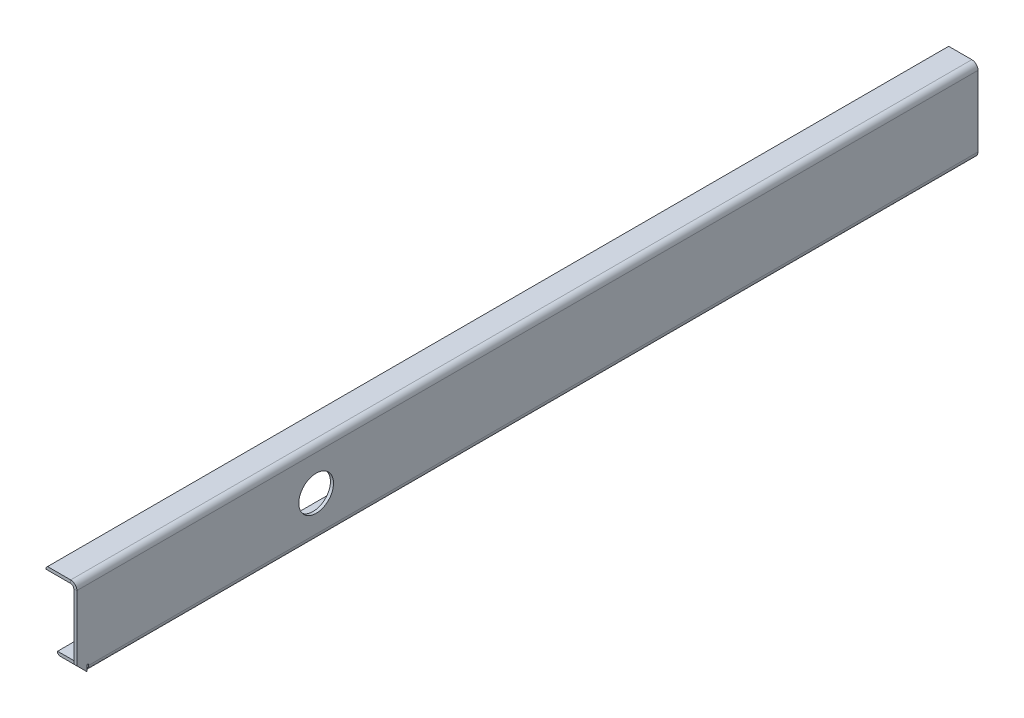
ISO-10303-21;
HEADER;
FILE_DESCRIPTION(('STEP AP214'),'2;1');
FILE_NAME('part.step','',(''),(''),'','','');
FILE_SCHEMA(('AUTOMOTIVE_DESIGN { 1 0 10303 214 1 1 1 1 }'));
ENDSEC;
DATA;
#1=APPLICATION_CONTEXT('core data for automotive mechanical design processes');
#2=APPLICATION_PROTOCOL_DEFINITION('international standard','automotive_design',2000,#1);
#3=PRODUCT_CONTEXT('',#1,'mechanical');
#4=PRODUCT('Part','Part','',(#3));
#5=PRODUCT_RELATED_PRODUCT_CATEGORY('part','',(#4));
#6=PRODUCT_DEFINITION_FORMATION('','',#4);
#7=PRODUCT_DEFINITION_CONTEXT('part definition',#1,'design');
#8=PRODUCT_DEFINITION('design','',#6,#7);
#9=PRODUCT_DEFINITION_SHAPE('','',#8);
#10=(LENGTH_UNIT() NAMED_UNIT(*) SI_UNIT(.MILLI.,.METRE.));
#11=(NAMED_UNIT(*) PLANE_ANGLE_UNIT() SI_UNIT($,.RADIAN.));
#12=(NAMED_UNIT(*) SI_UNIT($,.STERADIAN.) SOLID_ANGLE_UNIT());
#13=UNCERTAINTY_MEASURE_WITH_UNIT(LENGTH_MEASURE(1.E-05),#10,'distance_accuracy_value','');
#14=(GEOMETRIC_REPRESENTATION_CONTEXT(3) GLOBAL_UNCERTAINTY_ASSIGNED_CONTEXT((#13)) GLOBAL_UNIT_ASSIGNED_CONTEXT((#10,
#11,#12)) REPRESENTATION_CONTEXT('',''));
#15=CARTESIAN_POINT('',(0.,0.,0.));
#16=DIRECTION('',(0.,0.,1.));
#17=DIRECTION('',(1.,0.,0.));
#18=AXIS2_PLACEMENT_3D('',#15,#16,#17);
#19=CARTESIAN_POINT('',(-8.00000000000001,0.,0.));
#20=DIRECTION('',(-1.,0.,0.));
#21=DIRECTION('',(0.,0.,1.));
#22=AXIS2_PLACEMENT_3D('',#19,#20,#21);
#23=PLANE('',#22);
#24=CARTESIAN_POINT('',(-8.00000000000001,-107.5,-620.));
#25=DIRECTION('',(-1.,0.,0.));
#26=DIRECTION('',(0.,0.,1.));
#27=AXIS2_PLACEMENT_3D('',#24,#25,#26);
#28=CIRCLE('',#27,45.0000000000001);
#29=CARTESIAN_POINT('',(-8.00000000000001,-107.5,-575.));
#30=VERTEX_POINT('',#29);
#31=EDGE_CURVE('E241',#30,#30,#28,.T.);
#32=ORIENTED_EDGE('',*,*,#31,.F.);
#33=EDGE_LOOP('',(#32));
#34=FACE_BOUND('',#33,.T.);
#35=DIRECTION('',(0.,0.,-1.));
#36=VECTOR('',#35,1.);
#37=CARTESIAN_POINT('',(-8.00000000000006,-195.,-25.9999999999998));
#38=LINE('',#37,#36);
#39=CARTESIAN_POINT('',(-8.00000000000006,-195.,-25.9999999999998));
#40=VERTEX_POINT('',#39);
#41=CARTESIAN_POINT('',(-8.00000000000006,-195.,-29.9999999999998));
#42=VERTEX_POINT('',#41);
#43=EDGE_CURVE('E320',#40,#42,#38,.T.);
#44=ORIENTED_EDGE('',*,*,#43,.F.);
#45=DIRECTION('',(0.,1.,0.));
#46=VECTOR('',#45,1.);
#47=CARTESIAN_POINT('',(-8.00000000000006,-211.,-25.9999999999998));
#48=LINE('',#47,#46);
#49=CARTESIAN_POINT('',(-8.00000000000006,-211.,-25.9999999999998));
#50=VERTEX_POINT('',#49);
#51=EDGE_CURVE('E315',#50,#40,#48,.T.);
#52=ORIENTED_EDGE('',*,*,#51,.F.);
#53=DIRECTION('',(0.,-0.707106781186548,-0.707106781186547));
#54=VECTOR('',#53,1.);
#55=CARTESIAN_POINT('',(-8.00000000000001,-215.,-30.));
#56=LINE('',#55,#54);
#57=CARTESIAN_POINT('',(-8.00000000000001,-185.,0.));
#58=VERTEX_POINT('',#57);
#59=EDGE_CURVE('E336',#58,#50,#56,.T.);
#60=ORIENTED_EDGE('',*,*,#59,.F.);
#61=DIRECTION('',(0.,-1.,0.));
#62=VECTOR('',#61,1.);
#63=CARTESIAN_POINT('',(-8.00000000000001,-185.,0.));
#64=LINE('',#63,#62);
#65=CARTESIAN_POINT('',(-8.00000000000001,-16.,0.));
#66=VERTEX_POINT('',#65);
#67=EDGE_CURVE('E334',#66,#58,#64,.T.);
#68=ORIENTED_EDGE('',*,*,#67,.F.);
#69=DIRECTION('',(0.,0.,-1.));
#70=VECTOR('',#69,1.);
#71=CARTESIAN_POINT('',(-8.00000000000001,-16.,-2335.));
#72=LINE('',#71,#70);
#73=CARTESIAN_POINT('',(-8.00000000000001,-16.,-2335.));
#74=VERTEX_POINT('',#73);
#75=EDGE_CURVE('E305',#74,#66,#72,.F.);
#76=ORIENTED_EDGE('',*,*,#75,.F.);
#77=DIRECTION('',(0.,1.,0.));
#78=VECTOR('',#77,1.);
#79=CARTESIAN_POINT('',(-8.00000000000001,0.,-2335.));
#80=LINE('',#79,#78);
#81=CARTESIAN_POINT('',(-8.00000000000006,-199.,-2335.));
#82=VERTEX_POINT('',#81);
#83=EDGE_CURVE('E340',#82,#74,#80,.T.);
#84=ORIENTED_EDGE('',*,*,#83,.F.);
#85=DIRECTION('',(0.,0.,1.));
#86=VECTOR('',#85,1.);
#87=CARTESIAN_POINT('',(-8.00000000000006,-199.,-29.9999999999998));
#88=LINE('',#87,#86);
#89=CARTESIAN_POINT('',(-8.00000000000006,-199.,-29.9999999999998));
#90=VERTEX_POINT('',#89);
#91=EDGE_CURVE('E254',#90,#82,#88,.F.);
#92=ORIENTED_EDGE('',*,*,#91,.F.);
#93=DIRECTION('',(0.,-1.,0.));
#94=VECTOR('',#93,1.);
#95=CARTESIAN_POINT('',(-8.00000000000006,-195.,-29.9999999999998));
#96=LINE('',#95,#94);
#97=EDGE_CURVE('E324',#42,#90,#96,.T.);
#98=ORIENTED_EDGE('',*,*,#97,.F.);
#99=EDGE_LOOP('',(#44,#52,#60,#68,#76,#84,#92,#98));
#100=FACE_BOUND('',#99,.T.);
#101=ADVANCED_FACE('F78',(#34,#100),#23,.T.);
#102=CARTESIAN_POINT('',(0.,0.,0.));
#103=DIRECTION('',(-1.,0.,0.));
#104=DIRECTION('',(0.,0.,1.));
#105=AXIS2_PLACEMENT_3D('',#102,#103,#104);
#106=PLANE('',#105);
#107=CARTESIAN_POINT('',(0.,-107.5,-620.));
#108=DIRECTION('',(1.,0.,0.));
#109=DIRECTION('',(0.,0.,-1.));
#110=AXIS2_PLACEMENT_3D('',#107,#108,#109);
#111=CIRCLE('',#110,45.0000000000001);
#112=CARTESIAN_POINT('',(0.,-107.5,-665.));
#113=VERTEX_POINT('',#112);
#114=EDGE_CURVE('E507',#113,#113,#111,.T.);
#115=ORIENTED_EDGE('',*,*,#114,.F.);
#116=EDGE_LOOP('',(#115));
#117=FACE_BOUND('',#116,.T.);
#118=DIRECTION('',(0.,-1.,0.));
#119=VECTOR('',#118,1.);
#120=CARTESIAN_POINT('',(-1.11022302462516E-13,0.,-25.9999999999998));
#121=LINE('',#120,#119);
#122=CARTESIAN_POINT('',(-1.11022302462516E-13,-195.,-25.9999999999998));
#123=VERTEX_POINT('',#122);
#124=CARTESIAN_POINT('',(-1.11022302462516E-13,-211.,-25.9999999999998));
#125=VERTEX_POINT('',#124);
#126=EDGE_CURVE('E318',#123,#125,#121,.T.);
#127=ORIENTED_EDGE('',*,*,#126,.F.);
#128=DIRECTION('',(0.,0.,1.));
#129=VECTOR('',#128,1.);
#130=CARTESIAN_POINT('',(0.,-195.,0.));
#131=LINE('',#130,#129);
#132=CARTESIAN_POINT('',(-1.11022302462516E-13,-195.,-29.9999999999998));
#133=VERTEX_POINT('',#132);
#134=EDGE_CURVE('E353',#133,#123,#131,.T.);
#135=ORIENTED_EDGE('',*,*,#134,.F.);
#136=DIRECTION('',(0.,1.,0.));
#137=VECTOR('',#136,1.);
#138=CARTESIAN_POINT('',(-1.11022302462516E-13,0.,-29.9999999999998));
#139=LINE('',#138,#137);
#140=CARTESIAN_POINT('',(-1.66533453693773E-13,-199.,-29.9999999999998));
#141=VERTEX_POINT('',#140);
#142=EDGE_CURVE('E351',#141,#133,#139,.T.);
#143=ORIENTED_EDGE('',*,*,#142,.F.);
#144=DIRECTION('',(0.,0.,1.));
#145=VECTOR('',#144,1.);
#146=CARTESIAN_POINT('',(-1.66533453693773E-13,-199.,-29.9999999999998));
#147=LINE('',#146,#145);
#148=CARTESIAN_POINT('',(0.,-199.,-2335.));
#149=VERTEX_POINT('',#148);
#150=EDGE_CURVE('E242',#141,#149,#147,.F.);
#151=ORIENTED_EDGE('',*,*,#150,.T.);
#152=DIRECTION('',(0.,1.,0.));
#153=VECTOR('',#152,1.);
#154=CARTESIAN_POINT('',(0.,0.,-2335.));
#155=LINE('',#154,#153);
#156=CARTESIAN_POINT('',(0.,-16.,-2335.));
#157=VERTEX_POINT('',#156);
#158=EDGE_CURVE('E337',#149,#157,#155,.T.);
#159=ORIENTED_EDGE('',*,*,#158,.T.);
#160=DIRECTION('',(0.,0.,-1.));
#161=VECTOR('',#160,1.);
#162=CARTESIAN_POINT('',(0.,-16.,-2335.));
#163=LINE('',#162,#161);
#164=CARTESIAN_POINT('',(0.,-16.,0.));
#165=VERTEX_POINT('',#164);
#166=EDGE_CURVE('E293',#157,#165,#163,.F.);
#167=ORIENTED_EDGE('',*,*,#166,.T.);
#168=DIRECTION('',(0.,-1.,0.));
#169=VECTOR('',#168,1.);
#170=CARTESIAN_POINT('',(0.,-185.,0.));
#171=LINE('',#170,#169);
#172=CARTESIAN_POINT('',(0.,-185.,0.));
#173=VERTEX_POINT('',#172);
#174=EDGE_CURVE('E333',#165,#173,#171,.T.);
#175=ORIENTED_EDGE('',*,*,#174,.T.);
#176=DIRECTION('',(0.,-0.707106781186548,-0.707106781186547));
#177=VECTOR('',#176,1.);
#178=CARTESIAN_POINT('',(-1.11022302462516E-13,-215.,-30.));
#179=LINE('',#178,#177);
#180=EDGE_CURVE('E344',#173,#125,#179,.T.);
#181=ORIENTED_EDGE('',*,*,#180,.T.);
#182=EDGE_LOOP('',(#127,#135,#143,#151,#159,#167,#175,#181));
#183=FACE_BOUND('',#182,.T.);
#184=ADVANCED_FACE('F392',(#117,#183),#106,.F.);
#185=CARTESIAN_POINT('',(-8.00000000000001,-215.,-30.));
#186=DIRECTION('',(0.,-0.707106781186547,0.707106781186548));
#187=DIRECTION('',(0.,-0.707106781186548,-0.707106781186547));
#188=AXIS2_PLACEMENT_3D('',#185,#186,#187);
#189=PLANE('',#188);
#190=ORIENTED_EDGE('',*,*,#59,.T.);
#191=DIRECTION('',(1.,0.,0.));
#192=VECTOR('',#191,1.);
#193=CARTESIAN_POINT('',(-8.00000000000006,-211.,-25.9999999999998));
#194=LINE('',#193,#192);
#195=EDGE_CURVE('E319',#50,#125,#194,.T.);
#196=ORIENTED_EDGE('',*,*,#195,.T.);
#197=ORIENTED_EDGE('',*,*,#180,.F.);
#198=DIRECTION('',(1.,0.,0.));
#199=VECTOR('',#198,1.);
#200=CARTESIAN_POINT('',(-8.00000000000001,-185.,0.));
#201=LINE('',#200,#199);
#202=EDGE_CURVE('E342',#58,#173,#201,.T.);
#203=ORIENTED_EDGE('',*,*,#202,.F.);
#204=EDGE_LOOP('',(#190,#196,#197,#203));
#205=FACE_BOUND('',#204,.T.);
#206=ADVANCED_FACE('F398',(#205),#189,.T.);
#207=CARTESIAN_POINT('',(-8.00000000000001,0.,-2335.));
#208=DIRECTION('',(0.,0.,-1.));
#209=DIRECTION('',(-1.,0.,0.));
#210=AXIS2_PLACEMENT_3D('',#207,#208,#209);
#211=PLANE('',#210);
#212=DIRECTION('',(1.,0.,0.));
#213=VECTOR('',#212,1.);
#214=CARTESIAN_POINT('',(-8.00000000000006,-199.,-2335.));
#215=LINE('',#214,#213);
#216=EDGE_CURVE('E259',#82,#149,#215,.T.);
#217=ORIENTED_EDGE('',*,*,#216,.F.);
#218=ORIENTED_EDGE('',*,*,#83,.T.);
#219=DIRECTION('',(1.,0.,0.));
#220=VECTOR('',#219,1.);
#221=CARTESIAN_POINT('',(-8.00000000000001,-16.,-2335.));
#222=LINE('',#221,#220);
#223=EDGE_CURVE('E299',#74,#157,#222,.T.);
#224=ORIENTED_EDGE('',*,*,#223,.T.);
#225=ORIENTED_EDGE('',*,*,#158,.F.);
#226=EDGE_LOOP('',(#217,#218,#224,#225));
#227=FACE_BOUND('',#226,.T.);
#228=ADVANCED_FACE('F407',(#227),#211,.T.);
#229=CARTESIAN_POINT('',(-8.00000000000001,-185.,0.));
#230=DIRECTION('',(0.,0.,1.));
#231=DIRECTION('',(1.,0.,0.));
#232=AXIS2_PLACEMENT_3D('',#229,#230,#231);
#233=PLANE('',#232);
#234=DIRECTION('',(1.,0.,0.));
#235=VECTOR('',#234,1.);
#236=CARTESIAN_POINT('',(-8.00000000000001,-16.,0.));
#237=LINE('',#236,#235);
#238=EDGE_CURVE('E310',#66,#165,#237,.T.);
#239=ORIENTED_EDGE('',*,*,#238,.F.);
#240=ORIENTED_EDGE('',*,*,#67,.T.);
#241=ORIENTED_EDGE('',*,*,#202,.T.);
#242=ORIENTED_EDGE('',*,*,#174,.F.);
#243=EDGE_LOOP('',(#239,#240,#241,#242));
#244=FACE_BOUND('',#243,.T.);
#245=ADVANCED_FACE('F410',(#244),#233,.T.);
#246=CARTESIAN_POINT('',(-8.00000000000006,-195.,-25.9999999999998));
#247=DIRECTION('',(0.,-1.,0.));
#248=DIRECTION('',(0.,0.,-1.));
#249=AXIS2_PLACEMENT_3D('',#246,#247,#248);
#250=PLANE('',#249);
#251=DIRECTION('',(1.,0.,0.));
#252=VECTOR('',#251,1.);
#253=CARTESIAN_POINT('',(-8.00000000000006,-195.,-29.9999999999998));
#254=LINE('',#253,#252);
#255=EDGE_CURVE('E313',#42,#133,#254,.T.);
#256=ORIENTED_EDGE('',*,*,#255,.T.);
#257=ORIENTED_EDGE('',*,*,#134,.T.);
#258=DIRECTION('',(1.,0.,0.));
#259=VECTOR('',#258,1.);
#260=CARTESIAN_POINT('',(-8.00000000000006,-195.,-25.9999999999998));
#261=LINE('',#260,#259);
#262=EDGE_CURVE('E323',#40,#123,#261,.T.);
#263=ORIENTED_EDGE('',*,*,#262,.F.);
#264=ORIENTED_EDGE('',*,*,#43,.T.);
#265=EDGE_LOOP('',(#256,#257,#263,#264));
#266=FACE_BOUND('',#265,.T.);
#267=ADVANCED_FACE('F416',(#266),#250,.T.);
#268=CARTESIAN_POINT('',(-8.00000000000006,-195.,-29.9999999999998));
#269=DIRECTION('',(0.,0.,1.));
#270=DIRECTION('',(1.,0.,0.));
#271=AXIS2_PLACEMENT_3D('',#268,#269,#270);
#272=PLANE('',#271);
#273=DIRECTION('',(1.,0.,0.));
#274=VECTOR('',#273,1.);
#275=CARTESIAN_POINT('',(-8.00000000000006,-199.,-29.9999999999998));
#276=LINE('',#275,#274);
#277=EDGE_CURVE('E248',#90,#141,#276,.T.);
#278=ORIENTED_EDGE('',*,*,#277,.T.);
#279=ORIENTED_EDGE('',*,*,#142,.T.);
#280=ORIENTED_EDGE('',*,*,#255,.F.);
#281=ORIENTED_EDGE('',*,*,#97,.T.);
#282=EDGE_LOOP('',(#278,#279,#280,#281));
#283=FACE_BOUND('',#282,.T.);
#284=ADVANCED_FACE('F421',(#283),#272,.T.);
#285=CARTESIAN_POINT('',(-8.00000000000006,-211.,-25.9999999999998));
#286=DIRECTION('',(0.,0.,-1.));
#287=DIRECTION('',(-1.,0.,0.));
#288=AXIS2_PLACEMENT_3D('',#285,#286,#287);
#289=PLANE('',#288);
#290=ORIENTED_EDGE('',*,*,#262,.T.);
#291=ORIENTED_EDGE('',*,*,#126,.T.);
#292=ORIENTED_EDGE('',*,*,#195,.F.);
#293=ORIENTED_EDGE('',*,*,#51,.T.);
#294=EDGE_LOOP('',(#290,#291,#292,#293));
#295=FACE_BOUND('',#294,.T.);
#296=ADVANCED_FACE('F404',(#295),#289,.T.);
#297=CARTESIAN_POINT('',(-16.,-16.,0.));
#298=DIRECTION('',(0.,0.,1.));
#299=DIRECTION('',(1.,0.,0.));
#300=AXIS2_PLACEMENT_3D('',#297,#298,#299);
#301=PLANE('',#300);
#302=DIRECTION('',(0.,1.,0.));
#303=VECTOR('',#302,1.);
#304=CARTESIAN_POINT('',(-16.,0.,0.));
#305=LINE('',#304,#303);
#306=CARTESIAN_POINT('',(-16.,-8.00000000000001,0.));
#307=VERTEX_POINT('',#306);
#308=CARTESIAN_POINT('',(-16.,0.,0.));
#309=VERTEX_POINT('',#308);
#310=EDGE_CURVE('E262',#307,#309,#305,.T.);
#311=ORIENTED_EDGE('',*,*,#310,.F.);
#312=CARTESIAN_POINT('',(-16.,-16.,0.));
#313=DIRECTION('',(0.,0.,-1.));
#314=DIRECTION('',(-1.,0.,0.));
#315=AXIS2_PLACEMENT_3D('',#312,#313,#314);
#316=CIRCLE('',#315,8.);
#317=EDGE_CURVE('E302',#66,#307,#316,.F.);
#318=ORIENTED_EDGE('',*,*,#317,.F.);
#319=ORIENTED_EDGE('',*,*,#238,.T.);
#320=CARTESIAN_POINT('',(-16.,-16.,0.));
#321=DIRECTION('',(0.,0.,-1.));
#322=DIRECTION('',(-1.,0.,0.));
#323=AXIS2_PLACEMENT_3D('',#320,#321,#322);
#324=CIRCLE('',#323,16.);
#325=EDGE_CURVE('E295',#165,#309,#324,.F.);
#326=ORIENTED_EDGE('',*,*,#325,.T.);
#327=EDGE_LOOP('',(#311,#318,#319,#326));
#328=FACE_BOUND('',#327,.T.);
#329=ADVANCED_FACE('F438',(#328),#301,.T.);
#330=CARTESIAN_POINT('',(-16.,-16.,-2335.));
#331=DIRECTION('',(0.,0.,1.));
#332=DIRECTION('',(1.,0.,0.));
#333=AXIS2_PLACEMENT_3D('',#330,#331,#332);
#334=PLANE('',#333);
#335=CARTESIAN_POINT('',(-16.,-16.,-2335.));
#336=DIRECTION('',(0.,0.,-1.));
#337=DIRECTION('',(-1.,0.,0.));
#338=AXIS2_PLACEMENT_3D('',#335,#336,#337);
#339=CIRCLE('',#338,8.);
#340=CARTESIAN_POINT('',(-16.,-8.00000000000001,-2335.));
#341=VERTEX_POINT('',#340);
#342=EDGE_CURVE('E267',#341,#74,#339,.T.);
#343=ORIENTED_EDGE('',*,*,#342,.F.);
#344=DIRECTION('',(0.,1.,0.));
#345=VECTOR('',#344,1.);
#346=CARTESIAN_POINT('',(-16.,-8.00000000000001,-2335.));
#347=LINE('',#346,#345);
#348=CARTESIAN_POINT('',(-16.,0.,-2335.));
#349=VERTEX_POINT('',#348);
#350=EDGE_CURVE('E286',#341,#349,#347,.T.);
#351=ORIENTED_EDGE('',*,*,#350,.T.);
#352=CARTESIAN_POINT('',(-16.,-16.,-2335.));
#353=DIRECTION('',(0.,0.,-1.));
#354=DIRECTION('',(-1.,0.,0.));
#355=AXIS2_PLACEMENT_3D('',#352,#353,#354);
#356=CIRCLE('',#355,16.);
#357=EDGE_CURVE('E296',#349,#157,#356,.T.);
#358=ORIENTED_EDGE('',*,*,#357,.T.);
#359=ORIENTED_EDGE('',*,*,#223,.F.);
#360=EDGE_LOOP('',(#343,#351,#358,#359));
#361=FACE_BOUND('',#360,.T.);
#362=ADVANCED_FACE('F463',(#361),#334,.F.);
#363=CARTESIAN_POINT('',(-16.,-16.,-2335.));
#364=DIRECTION('',(0.,0.,-1.));
#365=DIRECTION('',(0.,1.,0.));
#366=AXIS2_PLACEMENT_3D('',#363,#364,#365);
#367=CYLINDRICAL_SURFACE('',#366,16.);
#368=ORIENTED_EDGE('',*,*,#166,.F.);
#369=ORIENTED_EDGE('',*,*,#357,.F.);
#370=DIRECTION('',(0.,0.,-1.));
#371=VECTOR('',#370,1.);
#372=CARTESIAN_POINT('',(-16.,0.,0.));
#373=LINE('',#372,#371);
#374=EDGE_CURVE('E283',#309,#349,#373,.T.);
#375=ORIENTED_EDGE('',*,*,#374,.F.);
#376=ORIENTED_EDGE('',*,*,#325,.F.);
#377=EDGE_LOOP('',(#368,#369,#375,#376));
#378=FACE_BOUND('',#377,.T.);
#379=ADVANCED_FACE('F441',(#378),#367,.T.);
#380=CARTESIAN_POINT('',(-16.,-16.,-2335.));
#381=DIRECTION('',(0.,0.,-1.));
#382=DIRECTION('',(0.,1.,0.));
#383=AXIS2_PLACEMENT_3D('',#380,#381,#382);
#384=CYLINDRICAL_SURFACE('',#383,8.);
#385=ORIENTED_EDGE('',*,*,#75,.T.);
#386=ORIENTED_EDGE('',*,*,#317,.T.);
#387=DIRECTION('',(0.,0.,1.));
#388=VECTOR('',#387,1.);
#389=CARTESIAN_POINT('',(-16.,-8.00000000000001,0.));
#390=LINE('',#389,#388);
#391=EDGE_CURVE('E289',#307,#341,#390,.F.);
#392=ORIENTED_EDGE('',*,*,#391,.T.);
#393=ORIENTED_EDGE('',*,*,#342,.T.);
#394=EDGE_LOOP('',(#385,#386,#392,#393));
#395=FACE_BOUND('',#394,.T.);
#396=ADVANCED_FACE('F436',(#395),#384,.F.);
#397=CARTESIAN_POINT('',(-8.00000000000001,0.,-2335.));
#398=DIRECTION('',(0.,0.,-1.));
#399=DIRECTION('',(-1.,0.,0.));
#400=AXIS2_PLACEMENT_3D('',#397,#398,#399);
#401=PLANE('',#400);
#402=DIRECTION('',(0.,-1.,0.));
#403=VECTOR('',#402,1.);
#404=CARTESIAN_POINT('',(-80.,2.22044604925031E-13,-2335.));
#405=LINE('',#404,#403);
#406=CARTESIAN_POINT('',(-80.,-3.99999999999956,-2335.));
#407=VERTEX_POINT('',#406);
#408=CARTESIAN_POINT('',(-80.,-7.99999999999979,-2335.));
#409=VERTEX_POINT('',#408);
#410=EDGE_CURVE('E265',#407,#409,#405,.T.);
#411=ORIENTED_EDGE('',*,*,#410,.F.);
#412=DIRECTION('',(-0.707106781186548,-0.707106781186548,0.));
#413=VECTOR('',#412,1.);
#414=CARTESIAN_POINT('',(-42.0000000000002,34.0000000000003,-2335.));
#415=LINE('',#414,#413);
#416=CARTESIAN_POINT('',(-76.0000000000003,2.22044604925031E-13,-2335.));
#417=VERTEX_POINT('',#416);
#418=EDGE_CURVE('E100',#407,#417,#415,.F.);
#419=ORIENTED_EDGE('',*,*,#418,.T.);
#420=DIRECTION('',(1.,0.,0.));
#421=VECTOR('',#420,1.);
#422=CARTESIAN_POINT('',(-8.00000000000001,0.,-2335.));
#423=LINE('',#422,#421);
#424=EDGE_CURVE('E270',#417,#349,#423,.T.);
#425=ORIENTED_EDGE('',*,*,#424,.T.);
#426=ORIENTED_EDGE('',*,*,#350,.F.);
#427=DIRECTION('',(-1.,0.,0.));
#428=VECTOR('',#427,1.);
#429=CARTESIAN_POINT('',(0.,-8.00000000000001,-2335.));
#430=LINE('',#429,#428);
#431=EDGE_CURVE('E274',#409,#341,#430,.F.);
#432=ORIENTED_EDGE('',*,*,#431,.F.);
#433=EDGE_LOOP('',(#411,#419,#425,#426,#432));
#434=FACE_BOUND('',#433,.T.);
#435=ADVANCED_FACE('F373',(#434),#401,.T.);
#436=CARTESIAN_POINT('',(-80.,2.22044604925031E-13,0.));
#437=DIRECTION('',(0.,0.,1.));
#438=DIRECTION('',(1.,0.,0.));
#439=AXIS2_PLACEMENT_3D('',#436,#437,#438);
#440=PLANE('',#439);
#441=DIRECTION('',(-1.,0.,0.));
#442=VECTOR('',#441,1.);
#443=CARTESIAN_POINT('',(-80.,2.22044604925031E-13,0.));
#444=LINE('',#443,#442);
#445=CARTESIAN_POINT('',(-76.0000000000002,2.22044604925031E-13,0.));
#446=VERTEX_POINT('',#445);
#447=EDGE_CURVE('E272',#309,#446,#444,.T.);
#448=ORIENTED_EDGE('',*,*,#447,.T.);
#449=DIRECTION('',(0.707106781186548,0.707106781186548,0.));
#450=VECTOR('',#449,1.);
#451=CARTESIAN_POINT('',(-78.0000000000001,-1.99999999999967,0.));
#452=LINE('',#451,#450);
#453=CARTESIAN_POINT('',(-80.,-3.99999999999956,0.));
#454=VERTEX_POINT('',#453);
#455=EDGE_CURVE('E13',#446,#454,#452,.F.);
#456=ORIENTED_EDGE('',*,*,#455,.T.);
#457=DIRECTION('',(0.,-1.,0.));
#458=VECTOR('',#457,1.);
#459=CARTESIAN_POINT('',(-80.,2.22044604925031E-13,0.));
#460=LINE('',#459,#458);
#461=CARTESIAN_POINT('',(-80.,-7.99999999999979,0.));
#462=VERTEX_POINT('',#461);
#463=EDGE_CURVE('E268',#454,#462,#460,.T.);
#464=ORIENTED_EDGE('',*,*,#463,.T.);
#465=DIRECTION('',(1.,0.,0.));
#466=VECTOR('',#465,1.);
#467=CARTESIAN_POINT('',(0.,-8.00000000000001,0.));
#468=LINE('',#467,#466);
#469=EDGE_CURVE('E280',#307,#462,#468,.F.);
#470=ORIENTED_EDGE('',*,*,#469,.F.);
#471=ORIENTED_EDGE('',*,*,#310,.T.);
#472=EDGE_LOOP('',(#448,#456,#464,#470,#471));
#473=FACE_BOUND('',#472,.T.);
#474=ADVANCED_FACE('F380',(#473),#440,.T.);
#475=CARTESIAN_POINT('',(0.,0.,0.));
#476=DIRECTION('',(0.,1.,0.));
#477=DIRECTION('',(-1.,0.,0.));
#478=AXIS2_PLACEMENT_3D('',#475,#476,#477);
#479=PLANE('',#478);
#480=ORIENTED_EDGE('',*,*,#424,.F.);
#481=DIRECTION('',(0.,0.,1.));
#482=VECTOR('',#481,1.);
#483=CARTESIAN_POINT('',(-76.0000000000002,2.22044604925031E-13,0.));
#484=LINE('',#483,#482);
#485=EDGE_CURVE('E86',#417,#446,#484,.T.);
#486=ORIENTED_EDGE('',*,*,#485,.T.);
#487=ORIENTED_EDGE('',*,*,#447,.F.);
#488=ORIENTED_EDGE('',*,*,#374,.T.);
#489=EDGE_LOOP('',(#480,#486,#487,#488));
#490=FACE_BOUND('',#489,.T.);
#491=ADVANCED_FACE('F443',(#490),#479,.T.);
#492=CARTESIAN_POINT('',(0.,-8.00000000000001,0.));
#493=DIRECTION('',(0.,1.,0.));
#494=DIRECTION('',(-1.,0.,0.));
#495=AXIS2_PLACEMENT_3D('',#492,#493,#494);
#496=PLANE('',#495);
#497=ORIENTED_EDGE('',*,*,#391,.F.);
#498=ORIENTED_EDGE('',*,*,#469,.T.);
#499=DIRECTION('',(0.,0.,1.));
#500=VECTOR('',#499,1.);
#501=CARTESIAN_POINT('',(-80.,-7.99999999999979,0.));
#502=LINE('',#501,#500);
#503=EDGE_CURVE('E277',#462,#409,#502,.F.);
#504=ORIENTED_EDGE('',*,*,#503,.T.);
#505=ORIENTED_EDGE('',*,*,#431,.T.);
#506=EDGE_LOOP('',(#497,#498,#504,#505));
#507=FACE_BOUND('',#506,.T.);
#508=ADVANCED_FACE('F377',(#507),#496,.F.);
#509=CARTESIAN_POINT('',(-80.,2.22044604925031E-13,-2335.));
#510=DIRECTION('',(-1.,0.,0.));
#511=DIRECTION('',(0.,-1.,0.));
#512=AXIS2_PLACEMENT_3D('',#509,#510,#511);
#513=PLANE('',#512);
#514=ORIENTED_EDGE('',*,*,#463,.F.);
#515=DIRECTION('',(0.,0.,-1.));
#516=VECTOR('',#515,1.);
#517=CARTESIAN_POINT('',(-80.,-3.99999999999956,-2335.));
#518=LINE('',#517,#516);
#519=EDGE_CURVE('E362',#454,#407,#518,.T.);
#520=ORIENTED_EDGE('',*,*,#519,.T.);
#521=ORIENTED_EDGE('',*,*,#410,.T.);
#522=ORIENTED_EDGE('',*,*,#503,.F.);
#523=EDGE_LOOP('',(#514,#520,#521,#522));
#524=FACE_BOUND('',#523,.T.);
#525=ADVANCED_FACE('F368',(#524),#513,.T.);
#526=CARTESIAN_POINT('',(-16.,-199.,-2335.));
#527=DIRECTION('',(0.,0.,-1.));
#528=DIRECTION('',(-1.,0.,0.));
#529=AXIS2_PLACEMENT_3D('',#526,#527,#528);
#530=PLANE('',#529);
#531=DIRECTION('',(0.,-1.,0.));
#532=VECTOR('',#531,1.);
#533=CARTESIAN_POINT('',(-16.,-215.,-2335.));
#534=LINE('',#533,#532);
#535=CARTESIAN_POINT('',(-16.,-207.,-2335.));
#536=VERTEX_POINT('',#535);
#537=CARTESIAN_POINT('',(-15.9999999999999,-215.,-2335.));
#538=VERTEX_POINT('',#537);
#539=EDGE_CURVE('E238',#536,#538,#534,.T.);
#540=ORIENTED_EDGE('',*,*,#539,.F.);
#541=CARTESIAN_POINT('',(-16.,-199.,-2335.));
#542=DIRECTION('',(0.,0.,1.));
#543=DIRECTION('',(1.,0.,0.));
#544=AXIS2_PLACEMENT_3D('',#541,#542,#543);
#545=CIRCLE('',#544,7.9999999999999);
#546=EDGE_CURVE('E251',#82,#536,#545,.F.);
#547=ORIENTED_EDGE('',*,*,#546,.F.);
#548=ORIENTED_EDGE('',*,*,#216,.T.);
#549=CARTESIAN_POINT('',(-16.,-199.,-2335.));
#550=DIRECTION('',(0.,0.,1.));
#551=DIRECTION('',(1.,0.,0.));
#552=AXIS2_PLACEMENT_3D('',#549,#550,#551);
#553=CIRCLE('',#552,15.9999999999999);
#554=EDGE_CURVE('E244',#149,#538,#553,.F.);
#555=ORIENTED_EDGE('',*,*,#554,.T.);
#556=EDGE_LOOP('',(#540,#547,#548,#555));
#557=FACE_BOUND('',#556,.T.);
#558=ADVANCED_FACE('F459',(#557),#530,.T.);
#559=CARTESIAN_POINT('',(-16.,-199.,-29.9999999999998));
#560=DIRECTION('',(0.,0.,-1.));
#561=DIRECTION('',(-1.,0.,0.));
#562=AXIS2_PLACEMENT_3D('',#559,#560,#561);
#563=PLANE('',#562);
#564=CARTESIAN_POINT('',(-16.,-199.,-29.9999999999998));
#565=DIRECTION('',(0.,0.,1.));
#566=DIRECTION('',(1.,0.,0.));
#567=AXIS2_PLACEMENT_3D('',#564,#565,#566);
#568=CIRCLE('',#567,7.9999999999999);
#569=CARTESIAN_POINT('',(-16.,-207.,-29.9999999999998));
#570=VERTEX_POINT('',#569);
#571=EDGE_CURVE('E212',#570,#90,#568,.T.);
#572=ORIENTED_EDGE('',*,*,#571,.F.);
#573=DIRECTION('',(0.,-1.,0.));
#574=VECTOR('',#573,1.);
#575=CARTESIAN_POINT('',(-15.9999999999999,-207.,-29.9999999999998));
#576=LINE('',#575,#574);
#577=CARTESIAN_POINT('',(-15.9999999999999,-215.,-29.9999999999998));
#578=VERTEX_POINT('',#577);
#579=EDGE_CURVE('E220',#570,#578,#576,.T.);
#580=ORIENTED_EDGE('',*,*,#579,.T.);
#581=CARTESIAN_POINT('',(-16.,-199.,-29.9999999999998));
#582=DIRECTION('',(0.,0.,1.));
#583=DIRECTION('',(1.,0.,0.));
#584=AXIS2_PLACEMENT_3D('',#581,#582,#583);
#585=CIRCLE('',#584,15.9999999999999);
#586=EDGE_CURVE('E245',#578,#141,#585,.T.);
#587=ORIENTED_EDGE('',*,*,#586,.T.);
#588=ORIENTED_EDGE('',*,*,#277,.F.);
#589=EDGE_LOOP('',(#572,#580,#587,#588));
#590=FACE_BOUND('',#589,.T.);
#591=ADVANCED_FACE('F453',(#590),#563,.F.);
#592=CARTESIAN_POINT('',(-16.,-199.,-29.9999999999998));
#593=DIRECTION('',(0.,0.,1.));
#594=DIRECTION('',(0.,-1.,0.));
#595=AXIS2_PLACEMENT_3D('',#592,#593,#594);
#596=CYLINDRICAL_SURFACE('',#595,15.9999999999999);
#597=ORIENTED_EDGE('',*,*,#150,.F.);
#598=ORIENTED_EDGE('',*,*,#586,.F.);
#599=DIRECTION('',(0.,0.,1.));
#600=VECTOR('',#599,1.);
#601=CARTESIAN_POINT('',(-16.,-215.,-2335.));
#602=LINE('',#601,#600);
#603=EDGE_CURVE('E230',#578,#538,#602,.F.);
#604=ORIENTED_EDGE('',*,*,#603,.T.);
#605=ORIENTED_EDGE('',*,*,#554,.F.);
#606=EDGE_LOOP('',(#597,#598,#604,#605));
#607=FACE_BOUND('',#606,.T.);
#608=ADVANCED_FACE('F486',(#607),#596,.T.);
#609=CARTESIAN_POINT('',(-16.,-199.,-29.9999999999998));
#610=DIRECTION('',(0.,0.,1.));
#611=DIRECTION('',(0.,-1.,0.));
#612=AXIS2_PLACEMENT_3D('',#609,#610,#611);
#613=CYLINDRICAL_SURFACE('',#612,7.9999999999999);
#614=ORIENTED_EDGE('',*,*,#91,.T.);
#615=ORIENTED_EDGE('',*,*,#546,.T.);
#616=DIRECTION('',(0.,0.,1.));
#617=VECTOR('',#616,1.);
#618=CARTESIAN_POINT('',(-16.,-207.,-2335.));
#619=LINE('',#618,#617);
#620=EDGE_CURVE('E236',#536,#570,#619,.T.);
#621=ORIENTED_EDGE('',*,*,#620,.T.);
#622=ORIENTED_EDGE('',*,*,#571,.T.);
#623=EDGE_LOOP('',(#614,#615,#621,#622));
#624=FACE_BOUND('',#623,.T.);
#625=ADVANCED_FACE('F515',(#624),#613,.F.);
#626=CARTESIAN_POINT('',(-8.00000000000001,-215.,-2335.));
#627=DIRECTION('',(0.,0.,-1.));
#628=DIRECTION('',(0.,1.,0.));
#629=AXIS2_PLACEMENT_3D('',#626,#627,#628);
#630=PLANE('',#629);
#631=DIRECTION('',(1.,0.,0.));
#632=VECTOR('',#631,1.);
#633=CARTESIAN_POINT('',(-8.00000000000001,-215.,-2335.));
#634=LINE('',#633,#632);
#635=CARTESIAN_POINT('',(-76.0000000000003,-215.,-2335.));
#636=VERTEX_POINT('',#635);
#637=EDGE_CURVE('E223',#538,#636,#634,.F.);
#638=ORIENTED_EDGE('',*,*,#637,.T.);
#639=DIRECTION('',(-0.707106781186548,0.707106781186547,0.));
#640=VECTOR('',#639,1.);
#641=CARTESIAN_POINT('',(-42.0000000000002,-249.,-2335.));
#642=LINE('',#641,#640);
#643=CARTESIAN_POINT('',(-80.,-211.000000000001,-2335.));
#644=VERTEX_POINT('',#643);
#645=EDGE_CURVE('E360',#636,#644,#642,.T.);
#646=ORIENTED_EDGE('',*,*,#645,.T.);
#647=DIRECTION('',(0.,1.,0.));
#648=VECTOR('',#647,1.);
#649=CARTESIAN_POINT('',(-80.,-215.,-2335.));
#650=LINE('',#649,#648);
#651=CARTESIAN_POINT('',(-80.,-207.,-2335.));
#652=VERTEX_POINT('',#651);
#653=EDGE_CURVE('E213',#644,#652,#650,.T.);
#654=ORIENTED_EDGE('',*,*,#653,.T.);
#655=DIRECTION('',(-1.,0.,0.));
#656=VECTOR('',#655,1.);
#657=CARTESIAN_POINT('',(7.49400541621981E-13,-207.,-2335.));
#658=LINE('',#657,#656);
#659=EDGE_CURVE('E228',#536,#652,#658,.T.);
#660=ORIENTED_EDGE('',*,*,#659,.F.);
#661=ORIENTED_EDGE('',*,*,#539,.T.);
#662=EDGE_LOOP('',(#638,#646,#654,#660,#661));
#663=FACE_BOUND('',#662,.T.);
#664=ADVANCED_FACE('F500',(#663),#630,.T.);
#665=CARTESIAN_POINT('',(-80.0000000000003,-215.000000000001,-30.));
#666=DIRECTION('',(0.,0.,1.));
#667=DIRECTION('',(1.,0.,0.));
#668=AXIS2_PLACEMENT_3D('',#665,#666,#667);
#669=PLANE('',#668);
#670=DIRECTION('',(0.,1.,0.));
#671=VECTOR('',#670,1.);
#672=CARTESIAN_POINT('',(-80.0000000000003,-215.000000000001,-29.9999999999998));
#673=LINE('',#672,#671);
#674=CARTESIAN_POINT('',(-80.0000000000003,-211.000000000001,-29.9999999999998));
#675=VERTEX_POINT('',#674);
#676=CARTESIAN_POINT('',(-80.0000000000003,-207.000000000001,-29.9999999999998));
#677=VERTEX_POINT('',#676);
#678=EDGE_CURVE('E203',#675,#677,#673,.T.);
#679=ORIENTED_EDGE('',*,*,#678,.F.);
#680=DIRECTION('',(0.707106781186548,-0.707106781186547,0.));
#681=VECTOR('',#680,1.);
#682=CARTESIAN_POINT('',(-78.0000000000004,-213.000000000001,-30.));
#683=LINE('',#682,#681);
#684=CARTESIAN_POINT('',(-76.0000000000003,-215.000000000001,-30.));
#685=VERTEX_POINT('',#684);
#686=EDGE_CURVE('E356',#675,#685,#683,.T.);
#687=ORIENTED_EDGE('',*,*,#686,.T.);
#688=DIRECTION('',(-1.,0.,0.));
#689=VECTOR('',#688,1.);
#690=CARTESIAN_POINT('',(-80.0000000000003,-215.000000000001,-30.));
#691=LINE('',#690,#689);
#692=EDGE_CURVE('E494',#685,#578,#691,.F.);
#693=ORIENTED_EDGE('',*,*,#692,.T.);
#694=ORIENTED_EDGE('',*,*,#579,.F.);
#695=DIRECTION('',(1.,0.,0.));
#696=VECTOR('',#695,1.);
#697=CARTESIAN_POINT('',(6.66133814775094E-13,-207.,-30.));
#698=LINE('',#697,#696);
#699=EDGE_CURVE('E217',#677,#570,#698,.T.);
#700=ORIENTED_EDGE('',*,*,#699,.F.);
#701=EDGE_LOOP('',(#679,#687,#693,#694,#700));
#702=FACE_BOUND('',#701,.T.);
#703=ADVANCED_FACE('F218',(#702),#669,.T.);
#704=CARTESIAN_POINT('',(7.7715611723761E-13,-215.,0.));
#705=DIRECTION('',(0.,1.,0.));
#706=DIRECTION('',(-1.,0.,0.));
#707=AXIS2_PLACEMENT_3D('',#704,#705,#706);
#708=PLANE('',#707);
#709=ORIENTED_EDGE('',*,*,#692,.F.);
#710=DIRECTION('',(0.,0.,-1.));
#711=VECTOR('',#710,1.);
#712=CARTESIAN_POINT('',(-76.0000000000003,-215.,-2335.));
#713=LINE('',#712,#711);
#714=EDGE_CURVE('E358',#685,#636,#713,.T.);
#715=ORIENTED_EDGE('',*,*,#714,.T.);
#716=ORIENTED_EDGE('',*,*,#637,.F.);
#717=ORIENTED_EDGE('',*,*,#603,.F.);
#718=EDGE_LOOP('',(#709,#715,#716,#717));
#719=FACE_BOUND('',#718,.T.);
#720=ADVANCED_FACE('F493',(#719),#708,.F.);
#721=CARTESIAN_POINT('',(7.49400541621981E-13,-207.,0.));
#722=DIRECTION('',(0.,1.,0.));
#723=DIRECTION('',(-1.,0.,0.));
#724=AXIS2_PLACEMENT_3D('',#721,#722,#723);
#725=PLANE('',#724);
#726=ORIENTED_EDGE('',*,*,#699,.T.);
#727=ORIENTED_EDGE('',*,*,#620,.F.);
#728=ORIENTED_EDGE('',*,*,#659,.T.);
#729=DIRECTION('',(0.,0.,1.));
#730=VECTOR('',#729,1.);
#731=CARTESIAN_POINT('',(-80.,-207.000000000001,0.));
#732=LINE('',#731,#730);
#733=EDGE_CURVE('E208',#652,#677,#732,.T.);
#734=ORIENTED_EDGE('',*,*,#733,.T.);
#735=EDGE_LOOP('',(#726,#727,#728,#734));
#736=FACE_BOUND('',#735,.T.);
#737=ADVANCED_FACE('F226',(#736),#725,.T.);
#738=CARTESIAN_POINT('',(-80.,-215.,-2335.));
#739=DIRECTION('',(-1.,0.,0.));
#740=DIRECTION('',(0.,-1.,0.));
#741=AXIS2_PLACEMENT_3D('',#738,#739,#740);
#742=PLANE('',#741);
#743=ORIENTED_EDGE('',*,*,#653,.F.);
#744=DIRECTION('',(0.,0.,1.));
#745=VECTOR('',#744,1.);
#746=CARTESIAN_POINT('',(-80.0000000000003,-211.000000000001,-29.9999999999998));
#747=LINE('',#746,#745);
#748=EDGE_CURVE('E210',#644,#675,#747,.T.);
#749=ORIENTED_EDGE('',*,*,#748,.T.);
#750=ORIENTED_EDGE('',*,*,#678,.T.);
#751=ORIENTED_EDGE('',*,*,#733,.F.);
#752=EDGE_LOOP('',(#743,#749,#750,#751));
#753=FACE_BOUND('',#752,.T.);
#754=ADVANCED_FACE('F206',(#753),#742,.T.);
#755=CARTESIAN_POINT('',(-80.,-211.000000000001,-2335.));
#756=DIRECTION('',(-0.707106781186547,-0.707106781186548,0.));
#757=DIRECTION('',(0.,0.,-1.));
#758=AXIS2_PLACEMENT_3D('',#755,#756,#757);
#759=PLANE('',#758);
#760=ORIENTED_EDGE('',*,*,#645,.F.);
#761=ORIENTED_EDGE('',*,*,#714,.F.);
#762=ORIENTED_EDGE('',*,*,#686,.F.);
#763=ORIENTED_EDGE('',*,*,#748,.F.);
#764=EDGE_LOOP('',(#760,#761,#762,#763));
#765=FACE_BOUND('',#764,.T.);
#766=ADVANCED_FACE('F383',(#765),#759,.T.);
#767=CARTESIAN_POINT('',(-80.,-3.99999999999956,-2335.));
#768=DIRECTION('',(0.707106781186547,-0.707106781186547,0.));
#769=DIRECTION('',(0.,0.,-1.));
#770=AXIS2_PLACEMENT_3D('',#767,#768,#769);
#771=PLANE('',#770);
#772=ORIENTED_EDGE('',*,*,#455,.F.);
#773=ORIENTED_EDGE('',*,*,#485,.F.);
#774=ORIENTED_EDGE('',*,*,#418,.F.);
#775=ORIENTED_EDGE('',*,*,#519,.F.);
#776=EDGE_LOOP('',(#772,#773,#774,#775));
#777=FACE_BOUND('',#776,.T.);
#778=ADVANCED_FACE('F80',(#777),#771,.F.);
#779=CARTESIAN_POINT('',(-80.,-107.5,-619.999999999998));
#780=DIRECTION('',(1.,0.,0.));
#781=DIRECTION('',(0.,0.,-1.));
#782=AXIS2_PLACEMENT_3D('',#779,#780,#781);
#783=CYLINDRICAL_SURFACE('',#782,45.0000000000001);
#784=ORIENTED_EDGE('',*,*,#31,.T.);
#785=EDGE_LOOP('',(#784));
#786=FACE_BOUND('',#785,.T.);
#787=ORIENTED_EDGE('',*,*,#114,.T.);
#788=EDGE_LOOP('',(#787));
#789=FACE_BOUND('',#788,.T.);
#790=ADVANCED_FACE('F382',(#786,#789),#783,.F.);
#791=CLOSED_SHELL('',(#101,#184,#206,#228,#245,#267,#284,#296,#329,#362,#379,#396,#435,#474,
#491,#508,#525,#558,#591,#608,#625,#664,#703,#720,#737,#754,#766,#778,#790));
#792=MANIFOLD_SOLID_BREP('B2',#791);
#793=ADVANCED_BREP_SHAPE_REPRESENTATION('',(#18,#792),#14);
#794=SHAPE_DEFINITION_REPRESENTATION(#9,#793);
ENDSEC;
END-ISO-10303-21;
